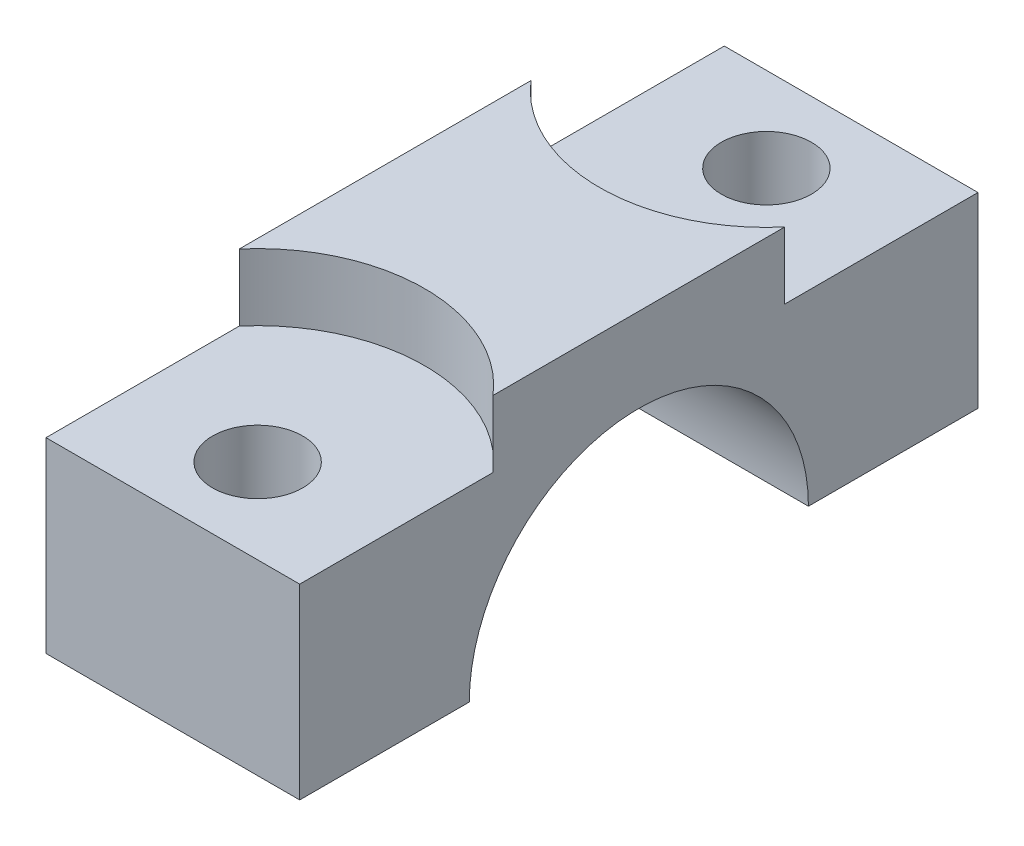
ISO-10303-21;
HEADER;
FILE_DESCRIPTION(('STEP AP214'),'2;1');
FILE_NAME('part.step','',(''),(''),'','','');
FILE_SCHEMA(('AUTOMOTIVE_DESIGN { 1 0 10303 214 1 1 1 1 }'));
ENDSEC;
DATA;
#1=APPLICATION_CONTEXT('core data for automotive mechanical design processes');
#2=APPLICATION_PROTOCOL_DEFINITION('international standard','automotive_design',2000,#1);
#3=PRODUCT_CONTEXT('',#1,'mechanical');
#4=PRODUCT('Part','Part','',(#3));
#5=PRODUCT_RELATED_PRODUCT_CATEGORY('part','',(#4));
#6=PRODUCT_DEFINITION_FORMATION('','',#4);
#7=PRODUCT_DEFINITION_CONTEXT('part definition',#1,'design');
#8=PRODUCT_DEFINITION('design','',#6,#7);
#9=PRODUCT_DEFINITION_SHAPE('','',#8);
#10=(LENGTH_UNIT() NAMED_UNIT(*) SI_UNIT(.MILLI.,.METRE.));
#11=(NAMED_UNIT(*) PLANE_ANGLE_UNIT() SI_UNIT($,.RADIAN.));
#12=(NAMED_UNIT(*) SI_UNIT($,.STERADIAN.) SOLID_ANGLE_UNIT());
#13=UNCERTAINTY_MEASURE_WITH_UNIT(LENGTH_MEASURE(1.E-05),#10,'distance_accuracy_value','');
#14=(GEOMETRIC_REPRESENTATION_CONTEXT(3) GLOBAL_UNCERTAINTY_ASSIGNED_CONTEXT((#13)) GLOBAL_UNIT_ASSIGNED_CONTEXT((#10,
#11,#12)) REPRESENTATION_CONTEXT('',''));
#15=CARTESIAN_POINT('',(0.,0.,0.));
#16=DIRECTION('',(0.,0.,1.));
#17=DIRECTION('',(1.,0.,0.));
#18=AXIS2_PLACEMENT_3D('',#15,#16,#17);
#19=CARTESIAN_POINT('',(9.5,0.,0.));
#20=DIRECTION('',(-1.,0.,0.));
#21=DIRECTION('',(0.,0.,1.));
#22=AXIS2_PLACEMENT_3D('',#19,#20,#21);
#23=CYLINDRICAL_SURFACE('',#22,12.7);
#24=CARTESIAN_POINT('',(-9.5,0.,0.));
#25=DIRECTION('',(1.,0.,0.));
#26=DIRECTION('',(0.,0.,-1.));
#27=AXIS2_PLACEMENT_3D('',#24,#25,#26);
#28=CIRCLE('',#27,12.7);
#29=CARTESIAN_POINT('',(-9.5,0.,-12.7));
#30=VERTEX_POINT('',#29);
#31=CARTESIAN_POINT('',(-9.5,0.,12.7));
#32=VERTEX_POINT('',#31);
#33=EDGE_CURVE('E153',#30,#32,#28,.T.);
#34=ORIENTED_EDGE('',*,*,#33,.F.);
#35=DIRECTION('',(-1.,0.,0.));
#36=VECTOR('',#35,1.);
#37=CARTESIAN_POINT('',(9.5,0.,-12.7));
#38=LINE('',#37,#36);
#39=CARTESIAN_POINT('',(9.5,0.,-12.7));
#40=VERTEX_POINT('',#39);
#41=EDGE_CURVE('E186',#40,#30,#38,.T.);
#42=ORIENTED_EDGE('',*,*,#41,.F.);
#43=CARTESIAN_POINT('',(9.5,0.,0.));
#44=DIRECTION('',(1.,0.,0.));
#45=DIRECTION('',(0.,0.,-1.));
#46=AXIS2_PLACEMENT_3D('',#43,#44,#45);
#47=CIRCLE('',#46,12.7);
#48=CARTESIAN_POINT('',(9.5,0.,12.7));
#49=VERTEX_POINT('',#48);
#50=EDGE_CURVE('E154',#40,#49,#47,.T.);
#51=ORIENTED_EDGE('',*,*,#50,.T.);
#52=DIRECTION('',(-1.,0.,0.));
#53=VECTOR('',#52,1.);
#54=CARTESIAN_POINT('',(9.5,0.,12.7));
#55=LINE('',#54,#53);
#56=EDGE_CURVE('E178',#49,#32,#55,.T.);
#57=ORIENTED_EDGE('',*,*,#56,.T.);
#58=EDGE_LOOP('',(#34,#42,#51,#57));
#59=FACE_BOUND('',#58,.T.);
#60=ADVANCED_FACE('F34',(#59),#23,.F.);
#61=CARTESIAN_POINT('',(9.5,0.,0.));
#62=DIRECTION('',(0.,1.,0.));
#63=DIRECTION('',(0.,0.,1.));
#64=AXIS2_PLACEMENT_3D('',#61,#62,#63);
#65=PLANE('',#64);
#66=CARTESIAN_POINT('',(0.,0.,-19.05));
#67=DIRECTION('',(0.,1.,0.));
#68=DIRECTION('',(0.,0.,1.));
#69=AXIS2_PLACEMENT_3D('',#66,#67,#68);
#70=CIRCLE('',#69,3.375);
#71=CARTESIAN_POINT('',(0.,0.,-15.675));
#72=VERTEX_POINT('',#71);
#73=EDGE_CURVE('E144',#72,#72,#70,.T.);
#74=ORIENTED_EDGE('',*,*,#73,.T.);
#75=EDGE_LOOP('',(#74));
#76=FACE_BOUND('',#75,.T.);
#77=DIRECTION('',(0.,0.,-1.));
#78=VECTOR('',#77,1.);
#79=CARTESIAN_POINT('',(-9.5,0.,0.));
#80=LINE('',#79,#78);
#81=CARTESIAN_POINT('',(-9.5,0.,-25.4));
#82=VERTEX_POINT('',#81);
#83=EDGE_CURVE('E169',#30,#82,#80,.T.);
#84=ORIENTED_EDGE('',*,*,#83,.T.);
#85=DIRECTION('',(-1.,0.,0.));
#86=VECTOR('',#85,1.);
#87=CARTESIAN_POINT('',(9.5,0.,-25.4));
#88=LINE('',#87,#86);
#89=CARTESIAN_POINT('',(9.5,0.,-25.4));
#90=VERTEX_POINT('',#89);
#91=EDGE_CURVE('E183',#90,#82,#88,.T.);
#92=ORIENTED_EDGE('',*,*,#91,.F.);
#93=DIRECTION('',(0.,0.,-1.));
#94=VECTOR('',#93,1.);
#95=CARTESIAN_POINT('',(9.5,0.,0.));
#96=LINE('',#95,#94);
#97=EDGE_CURVE('E157',#40,#90,#96,.T.);
#98=ORIENTED_EDGE('',*,*,#97,.F.);
#99=ORIENTED_EDGE('',*,*,#41,.T.);
#100=EDGE_LOOP('',(#84,#92,#98,#99));
#101=FACE_BOUND('',#100,.T.);
#102=ADVANCED_FACE('F226',(#76,#101),#65,.F.);
#103=CARTESIAN_POINT('',(9.5,0.,-25.4));
#104=DIRECTION('',(0.,0.,-1.));
#105=DIRECTION('',(0.,1.,0.));
#106=AXIS2_PLACEMENT_3D('',#103,#104,#105);
#107=PLANE('',#106);
#108=DIRECTION('',(-1.,0.,0.));
#109=VECTOR('',#108,1.);
#110=CARTESIAN_POINT('',(9.5,14.,-25.4));
#111=LINE('',#110,#109);
#112=CARTESIAN_POINT('',(9.5,14.,-25.4));
#113=VERTEX_POINT('',#112);
#114=CARTESIAN_POINT('',(-9.5,14.,-25.4));
#115=VERTEX_POINT('',#114);
#116=EDGE_CURVE('E149',#113,#115,#111,.T.);
#117=ORIENTED_EDGE('',*,*,#116,.F.);
#118=DIRECTION('',(0.,-1.,0.));
#119=VECTOR('',#118,1.);
#120=CARTESIAN_POINT('',(9.5,0.,-25.4));
#121=LINE('',#120,#119);
#122=EDGE_CURVE('E161',#113,#90,#121,.T.);
#123=ORIENTED_EDGE('',*,*,#122,.T.);
#124=ORIENTED_EDGE('',*,*,#91,.T.);
#125=DIRECTION('',(0.,-1.,0.));
#126=VECTOR('',#125,1.);
#127=CARTESIAN_POINT('',(-9.5,0.,-25.4));
#128=LINE('',#127,#126);
#129=EDGE_CURVE('E172',#115,#82,#128,.T.);
#130=ORIENTED_EDGE('',*,*,#129,.F.);
#131=EDGE_LOOP('',(#117,#123,#124,#130));
#132=FACE_BOUND('',#131,.T.);
#133=ADVANCED_FACE('F209',(#132),#107,.T.);
#134=CARTESIAN_POINT('',(9.5,19.,0.));
#135=DIRECTION('',(0.,1.,0.));
#136=DIRECTION('',(0.,0.,1.));
#137=AXIS2_PLACEMENT_3D('',#134,#135,#136);
#138=PLANE('',#137);
#139=CARTESIAN_POINT('',(0.,19.,19.05));
#140=DIRECTION('',(0.,1.,0.));
#141=DIRECTION('',(0.,0.,1.));
#142=AXIS2_PLACEMENT_3D('',#139,#140,#141);
#143=CIRCLE('',#142,12.5);
#144=CARTESIAN_POINT('',(9.5,19.,10.925961595364));
#145=VERTEX_POINT('',#144);
#146=CARTESIAN_POINT('',(-9.5,19.,10.925961595364));
#147=VERTEX_POINT('',#146);
#148=EDGE_CURVE('E48',#145,#147,#143,.T.);
#149=ORIENTED_EDGE('',*,*,#148,.F.);
#150=DIRECTION('',(0.,0.,-1.));
#151=VECTOR('',#150,1.);
#152=CARTESIAN_POINT('',(9.5,19.,0.));
#153=LINE('',#152,#151);
#154=CARTESIAN_POINT('',(9.5,19.,-10.925961595364));
#155=VERTEX_POINT('',#154);
#156=EDGE_CURVE('E130',#145,#155,#153,.T.);
#157=ORIENTED_EDGE('',*,*,#156,.T.);
#158=CARTESIAN_POINT('',(0.,19.,-19.05));
#159=DIRECTION('',(0.,1.,0.));
#160=DIRECTION('',(0.,0.,1.));
#161=AXIS2_PLACEMENT_3D('',#158,#159,#160);
#162=CIRCLE('',#161,12.5);
#163=CARTESIAN_POINT('',(-9.5,19.,-10.925961595364));
#164=VERTEX_POINT('',#163);
#165=EDGE_CURVE('E121',#164,#155,#162,.T.);
#166=ORIENTED_EDGE('',*,*,#165,.F.);
#167=DIRECTION('',(0.,0.,-1.));
#168=VECTOR('',#167,1.);
#169=CARTESIAN_POINT('',(-9.5,19.,0.));
#170=LINE('',#169,#168);
#171=EDGE_CURVE('E174',#147,#164,#170,.T.);
#172=ORIENTED_EDGE('',*,*,#171,.F.);
#173=EDGE_LOOP('',(#149,#157,#166,#172));
#174=FACE_BOUND('',#173,.T.);
#175=ADVANCED_FACE('F199',(#174),#138,.T.);
#176=CARTESIAN_POINT('',(9.5,0.,25.4));
#177=DIRECTION('',(0.,0.,-1.));
#178=DIRECTION('',(0.,1.,0.));
#179=AXIS2_PLACEMENT_3D('',#176,#177,#178);
#180=PLANE('',#179);
#181=DIRECTION('',(0.,-1.,0.));
#182=VECTOR('',#181,1.);
#183=CARTESIAN_POINT('',(9.5,0.,25.4));
#184=LINE('',#183,#182);
#185=CARTESIAN_POINT('',(9.5,14.,25.4));
#186=VERTEX_POINT('',#185);
#187=CARTESIAN_POINT('',(9.5,0.,25.4));
#188=VERTEX_POINT('',#187);
#189=EDGE_CURVE('E165',#186,#188,#184,.T.);
#190=ORIENTED_EDGE('',*,*,#189,.F.);
#191=DIRECTION('',(-1.,0.,0.));
#192=VECTOR('',#191,1.);
#193=CARTESIAN_POINT('',(9.5,14.,25.4));
#194=LINE('',#193,#192);
#195=CARTESIAN_POINT('',(-9.5,14.,25.4));
#196=VERTEX_POINT('',#195);
#197=EDGE_CURVE('E117',#186,#196,#194,.T.);
#198=ORIENTED_EDGE('',*,*,#197,.T.);
#199=DIRECTION('',(0.,-1.,0.));
#200=VECTOR('',#199,1.);
#201=CARTESIAN_POINT('',(-9.5,0.,25.4));
#202=LINE('',#201,#200);
#203=CARTESIAN_POINT('',(-9.5,0.,25.4));
#204=VERTEX_POINT('',#203);
#205=EDGE_CURVE('E176',#196,#204,#202,.T.);
#206=ORIENTED_EDGE('',*,*,#205,.T.);
#207=DIRECTION('',(-1.,0.,0.));
#208=VECTOR('',#207,1.);
#209=CARTESIAN_POINT('',(9.5,0.,25.4));
#210=LINE('',#209,#208);
#211=EDGE_CURVE('E180',#188,#204,#210,.T.);
#212=ORIENTED_EDGE('',*,*,#211,.F.);
#213=EDGE_LOOP('',(#190,#198,#206,#212));
#214=FACE_BOUND('',#213,.T.);
#215=ADVANCED_FACE('F225',(#214),#180,.F.);
#216=CARTESIAN_POINT('',(0.,0.,19.05));
#217=DIRECTION('',(0.,1.,0.));
#218=DIRECTION('',(0.,0.,1.));
#219=AXIS2_PLACEMENT_3D('',#216,#217,#218);
#220=CIRCLE('',#219,3.375);
#221=CARTESIAN_POINT('',(0.,0.,22.425));
#222=VERTEX_POINT('',#221);
#223=EDGE_CURVE('E131',#222,#222,#220,.T.);
#224=ORIENTED_EDGE('',*,*,#223,.T.);
#225=EDGE_LOOP('',(#224));
#226=FACE_BOUND('',#225,.T.);
#227=EDGE_CURVE('E158',#204,#32,#80,.T.);
#228=ORIENTED_EDGE('',*,*,#227,.T.);
#229=ORIENTED_EDGE('',*,*,#56,.F.);
#230=EDGE_CURVE('E162',#188,#49,#96,.T.);
#231=ORIENTED_EDGE('',*,*,#230,.F.);
#232=ORIENTED_EDGE('',*,*,#211,.T.);
#233=EDGE_LOOP('',(#228,#229,#231,#232));
#234=FACE_BOUND('',#233,.T.);
#235=ADVANCED_FACE('F222',(#226,#234),#65,.F.);
#236=CARTESIAN_POINT('',(9.5,0.,0.));
#237=DIRECTION('',(1.,0.,0.));
#238=DIRECTION('',(0.,0.,-1.));
#239=AXIS2_PLACEMENT_3D('',#236,#237,#238);
#240=PLANE('',#239);
#241=DIRECTION('',(0.,0.,-1.));
#242=VECTOR('',#241,1.);
#243=CARTESIAN_POINT('',(9.5,14.,0.));
#244=LINE('',#243,#242);
#245=CARTESIAN_POINT('',(9.5,14.,10.925961595364));
#246=VERTEX_POINT('',#245);
#247=EDGE_CURVE('E111',#186,#246,#244,.T.);
#248=ORIENTED_EDGE('',*,*,#247,.F.);
#249=ORIENTED_EDGE('',*,*,#189,.T.);
#250=ORIENTED_EDGE('',*,*,#230,.T.);
#251=ORIENTED_EDGE('',*,*,#50,.F.);
#252=ORIENTED_EDGE('',*,*,#97,.T.);
#253=ORIENTED_EDGE('',*,*,#122,.F.);
#254=DIRECTION('',(0.,0.,-1.));
#255=VECTOR('',#254,1.);
#256=CARTESIAN_POINT('',(9.5,14.,0.));
#257=LINE('',#256,#255);
#258=CARTESIAN_POINT('',(9.5,14.,-10.925961595364));
#259=VERTEX_POINT('',#258);
#260=EDGE_CURVE('E151',#259,#113,#257,.T.);
#261=ORIENTED_EDGE('',*,*,#260,.F.);
#262=DIRECTION('',(0.,1.,0.));
#263=VECTOR('',#262,1.);
#264=CARTESIAN_POINT('',(9.5,19.,-10.925961595364));
#265=LINE('',#264,#263);
#266=EDGE_CURVE('E147',#155,#259,#265,.F.);
#267=ORIENTED_EDGE('',*,*,#266,.F.);
#268=ORIENTED_EDGE('',*,*,#156,.F.);
#269=DIRECTION('',(0.,1.,0.));
#270=VECTOR('',#269,1.);
#271=CARTESIAN_POINT('',(9.5,19.,10.925961595364));
#272=LINE('',#271,#270);
#273=EDGE_CURVE('E124',#246,#145,#272,.T.);
#274=ORIENTED_EDGE('',*,*,#273,.F.);
#275=EDGE_LOOP('',(#248,#249,#250,#251,#252,#253,#261,#267,#268,#274));
#276=FACE_BOUND('',#275,.T.);
#277=ADVANCED_FACE('F128',(#276),#240,.T.);
#278=CARTESIAN_POINT('',(-9.5,0.,0.));
#279=DIRECTION('',(1.,0.,0.));
#280=DIRECTION('',(0.,0.,-1.));
#281=AXIS2_PLACEMENT_3D('',#278,#279,#280);
#282=PLANE('',#281);
#283=ORIENTED_EDGE('',*,*,#205,.F.);
#284=DIRECTION('',(0.,0.,-1.));
#285=VECTOR('',#284,1.);
#286=CARTESIAN_POINT('',(-9.5,14.,0.));
#287=LINE('',#286,#285);
#288=CARTESIAN_POINT('',(-9.5,14.,10.925961595364));
#289=VERTEX_POINT('',#288);
#290=EDGE_CURVE('E11',#196,#289,#287,.T.);
#291=ORIENTED_EDGE('',*,*,#290,.T.);
#292=DIRECTION('',(0.,1.,0.));
#293=VECTOR('',#292,1.);
#294=CARTESIAN_POINT('',(-9.5,19.,10.925961595364));
#295=LINE('',#294,#293);
#296=EDGE_CURVE('E41',#289,#147,#295,.T.);
#297=ORIENTED_EDGE('',*,*,#296,.T.);
#298=ORIENTED_EDGE('',*,*,#171,.T.);
#299=DIRECTION('',(0.,1.,0.));
#300=VECTOR('',#299,1.);
#301=CARTESIAN_POINT('',(-9.5,19.,-10.925961595364));
#302=LINE('',#301,#300);
#303=CARTESIAN_POINT('',(-9.5,14.,-10.925961595364));
#304=VERTEX_POINT('',#303);
#305=EDGE_CURVE('E188',#164,#304,#302,.F.);
#306=ORIENTED_EDGE('',*,*,#305,.T.);
#307=DIRECTION('',(0.,0.,-1.));
#308=VECTOR('',#307,1.);
#309=CARTESIAN_POINT('',(-9.5,14.,0.));
#310=LINE('',#309,#308);
#311=EDGE_CURVE('E191',#304,#115,#310,.T.);
#312=ORIENTED_EDGE('',*,*,#311,.T.);
#313=ORIENTED_EDGE('',*,*,#129,.T.);
#314=ORIENTED_EDGE('',*,*,#83,.F.);
#315=ORIENTED_EDGE('',*,*,#33,.T.);
#316=ORIENTED_EDGE('',*,*,#227,.F.);
#317=EDGE_LOOP('',(#283,#291,#297,#298,#306,#312,#313,#314,#315,#316));
#318=FACE_BOUND('',#317,.T.);
#319=ADVANCED_FACE('F196',(#318),#282,.F.);
#320=CARTESIAN_POINT('',(0.,19.,-19.05));
#321=DIRECTION('',(0.,1.,0.));
#322=DIRECTION('',(0.,0.,1.));
#323=AXIS2_PLACEMENT_3D('',#320,#321,#322);
#324=CYLINDRICAL_SURFACE('',#323,3.375);
#325=ORIENTED_EDGE('',*,*,#73,.F.);
#326=EDGE_LOOP('',(#325));
#327=FACE_BOUND('',#326,.T.);
#328=CARTESIAN_POINT('',(0.,14.,-19.05));
#329=DIRECTION('',(0.,1.,0.));
#330=DIRECTION('',(0.,0.,1.));
#331=AXIS2_PLACEMENT_3D('',#328,#329,#330);
#332=CIRCLE('',#331,3.375);
#333=CARTESIAN_POINT('',(0.,14.,-15.675));
#334=VERTEX_POINT('',#333);
#335=EDGE_CURVE('E141',#334,#334,#332,.T.);
#336=ORIENTED_EDGE('',*,*,#335,.T.);
#337=EDGE_LOOP('',(#336));
#338=FACE_BOUND('',#337,.T.);
#339=ADVANCED_FACE('F263',(#327,#338),#324,.F.);
#340=CARTESIAN_POINT('',(3.375,14.,-19.05));
#341=DIRECTION('',(0.,-1.,0.));
#342=DIRECTION('',(0.,0.,-1.));
#343=AXIS2_PLACEMENT_3D('',#340,#341,#342);
#344=PLANE('',#343);
#345=ORIENTED_EDGE('',*,*,#260,.T.);
#346=ORIENTED_EDGE('',*,*,#116,.T.);
#347=ORIENTED_EDGE('',*,*,#311,.F.);
#348=CARTESIAN_POINT('',(0.,14.,-19.05));
#349=DIRECTION('',(0.,1.,0.));
#350=DIRECTION('',(0.,0.,1.));
#351=AXIS2_PLACEMENT_3D('',#348,#349,#350);
#352=CIRCLE('',#351,12.5);
#353=EDGE_CURVE('E56',#304,#259,#352,.T.);
#354=ORIENTED_EDGE('',*,*,#353,.T.);
#355=EDGE_LOOP('',(#345,#346,#347,#354));
#356=FACE_BOUND('',#355,.T.);
#357=ORIENTED_EDGE('',*,*,#335,.F.);
#358=EDGE_LOOP('',(#357));
#359=FACE_BOUND('',#358,.T.);
#360=ADVANCED_FACE('F205',(#356,#359),#344,.F.);
#361=CARTESIAN_POINT('',(0.,19.,-19.05));
#362=DIRECTION('',(0.,1.,0.));
#363=DIRECTION('',(0.,0.,1.));
#364=AXIS2_PLACEMENT_3D('',#361,#362,#363);
#365=CYLINDRICAL_SURFACE('',#364,12.5);
#366=ORIENTED_EDGE('',*,*,#266,.T.);
#367=ORIENTED_EDGE('',*,*,#353,.F.);
#368=ORIENTED_EDGE('',*,*,#305,.F.);
#369=ORIENTED_EDGE('',*,*,#165,.T.);
#370=EDGE_LOOP('',(#366,#367,#368,#369));
#371=FACE_BOUND('',#370,.T.);
#372=ADVANCED_FACE('F200',(#371),#365,.F.);
#373=CARTESIAN_POINT('',(0.,19.,19.05));
#374=DIRECTION('',(0.,1.,0.));
#375=DIRECTION('',(0.,0.,1.));
#376=AXIS2_PLACEMENT_3D('',#373,#374,#375);
#377=CYLINDRICAL_SURFACE('',#376,3.375);
#378=ORIENTED_EDGE('',*,*,#223,.F.);
#379=EDGE_LOOP('',(#378));
#380=FACE_BOUND('',#379,.T.);
#381=CARTESIAN_POINT('',(0.,14.,19.05));
#382=DIRECTION('',(0.,1.,0.));
#383=DIRECTION('',(0.,0.,1.));
#384=AXIS2_PLACEMENT_3D('',#381,#382,#383);
#385=CIRCLE('',#384,3.375);
#386=CARTESIAN_POINT('',(0.,14.,22.425));
#387=VERTEX_POINT('',#386);
#388=EDGE_CURVE('E125',#387,#387,#385,.T.);
#389=ORIENTED_EDGE('',*,*,#388,.T.);
#390=EDGE_LOOP('',(#389));
#391=FACE_BOUND('',#390,.T.);
#392=ADVANCED_FACE('F245',(#380,#391),#377,.F.);
#393=CARTESIAN_POINT('',(3.375,14.,19.05));
#394=DIRECTION('',(0.,-1.,0.));
#395=DIRECTION('',(0.,0.,-1.));
#396=AXIS2_PLACEMENT_3D('',#393,#394,#395);
#397=PLANE('',#396);
#398=ORIENTED_EDGE('',*,*,#247,.T.);
#399=CARTESIAN_POINT('',(0.,14.,19.05));
#400=DIRECTION('',(0.,1.,0.));
#401=DIRECTION('',(0.,0.,1.));
#402=AXIS2_PLACEMENT_3D('',#399,#400,#401);
#403=CIRCLE('',#402,12.5);
#404=EDGE_CURVE('E115',#246,#289,#403,.T.);
#405=ORIENTED_EDGE('',*,*,#404,.T.);
#406=ORIENTED_EDGE('',*,*,#290,.F.);
#407=ORIENTED_EDGE('',*,*,#197,.F.);
#408=EDGE_LOOP('',(#398,#405,#406,#407));
#409=FACE_BOUND('',#408,.T.);
#410=ORIENTED_EDGE('',*,*,#388,.F.);
#411=EDGE_LOOP('',(#410));
#412=FACE_BOUND('',#411,.T.);
#413=ADVANCED_FACE('F113',(#409,#412),#397,.F.);
#414=CARTESIAN_POINT('',(0.,19.,19.05));
#415=DIRECTION('',(0.,1.,0.));
#416=DIRECTION('',(0.,0.,1.));
#417=AXIS2_PLACEMENT_3D('',#414,#415,#416);
#418=CYLINDRICAL_SURFACE('',#417,12.5);
#419=ORIENTED_EDGE('',*,*,#273,.T.);
#420=ORIENTED_EDGE('',*,*,#148,.T.);
#421=ORIENTED_EDGE('',*,*,#296,.F.);
#422=ORIENTED_EDGE('',*,*,#404,.F.);
#423=EDGE_LOOP('',(#419,#420,#421,#422));
#424=FACE_BOUND('',#423,.T.);
#425=ADVANCED_FACE('F123',(#424),#418,.F.);
#426=CLOSED_SHELL('',(#60,#102,#133,#175,#215,#235,#277,#319,#339,#360,#372,#392,#413,#425));
#427=MANIFOLD_SOLID_BREP('B2',#426);
#428=ADVANCED_BREP_SHAPE_REPRESENTATION('',(#18,#427),#14);
#429=SHAPE_DEFINITION_REPRESENTATION(#9,#428);
ENDSEC;
END-ISO-10303-21;
